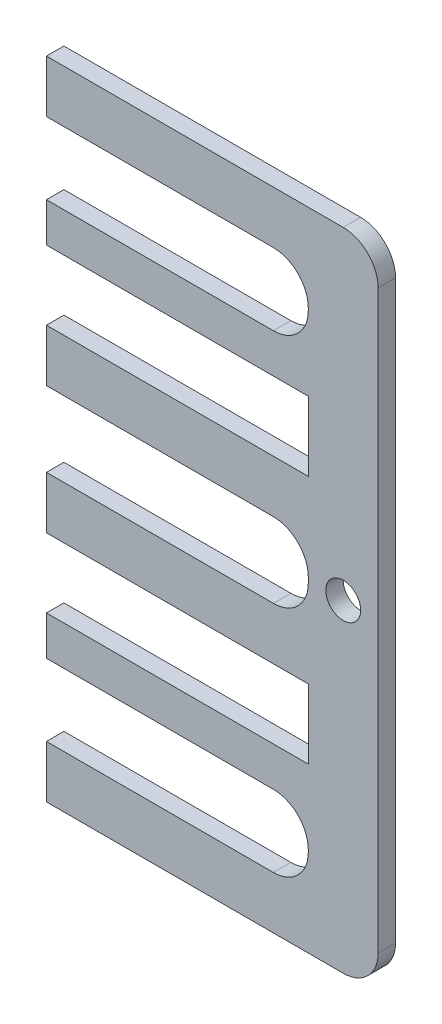
ISO-10303-21;
HEADER;
FILE_DESCRIPTION(('STEP AP214'),'2;1');
FILE_NAME('part.step','',(''),(''),'','','');
FILE_SCHEMA(('AUTOMOTIVE_DESIGN { 1 0 10303 214 1 1 1 1 }'));
ENDSEC;
DATA;
#1=APPLICATION_CONTEXT('core data for automotive mechanical design processes');
#2=APPLICATION_PROTOCOL_DEFINITION('international standard','automotive_design',2000,#1);
#3=PRODUCT_CONTEXT('',#1,'mechanical');
#4=PRODUCT('Part','Part','',(#3));
#5=PRODUCT_RELATED_PRODUCT_CATEGORY('part','',(#4));
#6=PRODUCT_DEFINITION_FORMATION('','',#4);
#7=PRODUCT_DEFINITION_CONTEXT('part definition',#1,'design');
#8=PRODUCT_DEFINITION('design','',#6,#7);
#9=PRODUCT_DEFINITION_SHAPE('','',#8);
#10=(LENGTH_UNIT() NAMED_UNIT(*) SI_UNIT(.MILLI.,.METRE.));
#11=(NAMED_UNIT(*) PLANE_ANGLE_UNIT() SI_UNIT($,.RADIAN.));
#12=(NAMED_UNIT(*) SI_UNIT($,.STERADIAN.) SOLID_ANGLE_UNIT());
#13=UNCERTAINTY_MEASURE_WITH_UNIT(LENGTH_MEASURE(1.E-05),#10,'distance_accuracy_value','');
#14=(GEOMETRIC_REPRESENTATION_CONTEXT(3) GLOBAL_UNCERTAINTY_ASSIGNED_CONTEXT((#13)) GLOBAL_UNIT_ASSIGNED_CONTEXT((#10,
#11,#12)) REPRESENTATION_CONTEXT('',''));
#15=CARTESIAN_POINT('',(0.,0.,0.));
#16=DIRECTION('',(0.,0.,1.));
#17=DIRECTION('',(1.,0.,0.));
#18=AXIS2_PLACEMENT_3D('',#15,#16,#17);
#19=CARTESIAN_POINT('',(0.,0.,2.));
#20=DIRECTION('',(0.,0.,1.));
#21=DIRECTION('',(1.,0.,0.));
#22=AXIS2_PLACEMENT_3D('',#19,#20,#21);
#23=PLANE('',#22);
#24=DIRECTION('',(1.,0.,0.));
#25=VECTOR('',#24,1.);
#26=CARTESIAN_POINT('',(0.,-37.,2.));
#27=LINE('',#26,#25);
#28=CARTESIAN_POINT('',(-38.,-37.,2.));
#29=VERTEX_POINT('',#28);
#30=CARTESIAN_POINT('',(-3.99999999999999,-37.,2.));
#31=VERTEX_POINT('',#30);
#32=EDGE_CURVE('E271',#29,#31,#27,.T.);
#33=ORIENTED_EDGE('',*,*,#32,.T.);
#34=CARTESIAN_POINT('',(-3.99999999999999,-33.,2.));
#35=DIRECTION('',(0.,0.,1.));
#36=DIRECTION('',(1.,0.,0.));
#37=AXIS2_PLACEMENT_3D('',#34,#35,#36);
#38=CIRCLE('',#37,4.);
#39=CARTESIAN_POINT('',(0.,-33.,2.));
#40=VERTEX_POINT('',#39);
#41=EDGE_CURVE('E342',#31,#40,#38,.T.);
#42=ORIENTED_EDGE('',*,*,#41,.T.);
#43=DIRECTION('',(0.,1.,0.));
#44=VECTOR('',#43,1.);
#45=CARTESIAN_POINT('',(0.,37.,2.));
#46=LINE('',#45,#44);
#47=CARTESIAN_POINT('',(0.,33.,2.));
#48=VERTEX_POINT('',#47);
#49=EDGE_CURVE('E986',#40,#48,#46,.T.);
#50=ORIENTED_EDGE('',*,*,#49,.T.);
#51=CARTESIAN_POINT('',(-3.99999999999999,33.,2.));
#52=DIRECTION('',(0.,0.,1.));
#53=DIRECTION('',(1.,0.,0.));
#54=AXIS2_PLACEMENT_3D('',#51,#52,#53);
#55=CIRCLE('',#54,4.);
#56=CARTESIAN_POINT('',(-3.99999999999999,37.,2.));
#57=VERTEX_POINT('',#56);
#58=EDGE_CURVE('E55',#48,#57,#55,.T.);
#59=ORIENTED_EDGE('',*,*,#58,.T.);
#60=DIRECTION('',(-1.,0.,0.));
#61=VECTOR('',#60,1.);
#62=CARTESIAN_POINT('',(0.,37.,2.));
#63=LINE('',#62,#61);
#64=CARTESIAN_POINT('',(-38.,37.,2.));
#65=VERTEX_POINT('',#64);
#66=EDGE_CURVE('E984',#57,#65,#63,.T.);
#67=ORIENTED_EDGE('',*,*,#66,.T.);
#68=DIRECTION('',(0.,-1.,0.));
#69=VECTOR('',#68,1.);
#70=CARTESIAN_POINT('',(-38.,31.,2.));
#71=LINE('',#70,#69);
#72=CARTESIAN_POINT('',(-38.,31.,2.));
#73=VERTEX_POINT('',#72);
#74=EDGE_CURVE('E545',#65,#73,#71,.T.);
#75=ORIENTED_EDGE('',*,*,#74,.T.);
#76=DIRECTION('',(1.,0.,0.));
#77=VECTOR('',#76,1.);
#78=CARTESIAN_POINT('',(-38.,31.,2.));
#79=LINE('',#78,#77);
#80=CARTESIAN_POINT('',(-12.,31.,2.));
#81=VERTEX_POINT('',#80);
#82=EDGE_CURVE('E563',#73,#81,#79,.T.);
#83=ORIENTED_EDGE('',*,*,#82,.T.);
#84=CARTESIAN_POINT('',(-12.,27.,2.));
#85=DIRECTION('',(0.,0.,1.));
#86=DIRECTION('',(1.,0.,0.));
#87=AXIS2_PLACEMENT_3D('',#84,#85,#86);
#88=CIRCLE('',#87,4.);
#89=CARTESIAN_POINT('',(-8.00000000000001,27.,2.));
#90=VERTEX_POINT('',#89);
#91=EDGE_CURVE('E358',#81,#90,#88,.F.);
#92=ORIENTED_EDGE('',*,*,#91,.T.);
#93=DIRECTION('',(0.,-1.,0.));
#94=VECTOR('',#93,1.);
#95=CARTESIAN_POINT('',(-8.00000000000001,31.,2.));
#96=LINE('',#95,#94);
#97=CARTESIAN_POINT('',(-8.00000000000001,26.75,2.));
#98=VERTEX_POINT('',#97);
#99=EDGE_CURVE('E561',#90,#98,#96,.T.);
#100=ORIENTED_EDGE('',*,*,#99,.T.);
#101=CARTESIAN_POINT('',(-12.,26.75,2.));
#102=DIRECTION('',(0.,0.,1.));
#103=DIRECTION('',(1.,0.,0.));
#104=AXIS2_PLACEMENT_3D('',#101,#102,#103);
#105=CIRCLE('',#104,4.);
#106=CARTESIAN_POINT('',(-12.,22.75,2.));
#107=VERTEX_POINT('',#106);
#108=EDGE_CURVE('E352',#98,#107,#105,.F.);
#109=ORIENTED_EDGE('',*,*,#108,.T.);
#110=DIRECTION('',(-1.,0.,0.));
#111=VECTOR('',#110,1.);
#112=CARTESIAN_POINT('',(-8.00000000000001,22.75,2.));
#113=LINE('',#112,#111);
#114=CARTESIAN_POINT('',(-38.,22.75,2.));
#115=VERTEX_POINT('',#114);
#116=EDGE_CURVE('E568',#107,#115,#113,.T.);
#117=ORIENTED_EDGE('',*,*,#116,.T.);
#118=DIRECTION('',(0.,-1.,0.));
#119=VECTOR('',#118,1.);
#120=CARTESIAN_POINT('',(-38.,22.75,2.));
#121=LINE('',#120,#119);
#122=CARTESIAN_POINT('',(-38.,18.25,2.));
#123=VERTEX_POINT('',#122);
#124=EDGE_CURVE('E572',#115,#123,#121,.T.);
#125=ORIENTED_EDGE('',*,*,#124,.T.);
#126=DIRECTION('',(1.,0.,0.));
#127=VECTOR('',#126,1.);
#128=CARTESIAN_POINT('',(-38.,18.25,2.));
#129=LINE('',#128,#127);
#130=CARTESIAN_POINT('',(-8.00000000000001,18.25,2.));
#131=VERTEX_POINT('',#130);
#132=EDGE_CURVE('E579',#123,#131,#129,.T.);
#133=ORIENTED_EDGE('',*,*,#132,.T.);
#134=DIRECTION('',(0.,-1.,0.));
#135=VECTOR('',#134,1.);
#136=CARTESIAN_POINT('',(-8.00000000000001,18.25,2.));
#137=LINE('',#136,#135);
#138=CARTESIAN_POINT('',(-8.00000000000001,10.3,2.));
#139=VERTEX_POINT('',#138);
#140=EDGE_CURVE('E582',#131,#139,#137,.T.);
#141=ORIENTED_EDGE('',*,*,#140,.T.);
#142=DIRECTION('',(-1.,0.,0.));
#143=VECTOR('',#142,1.);
#144=CARTESIAN_POINT('',(-8.00000000000001,10.3,2.));
#145=LINE('',#144,#143);
#146=CARTESIAN_POINT('',(-38.,10.3,2.));
#147=VERTEX_POINT('',#146);
#148=EDGE_CURVE('E585',#139,#147,#145,.T.);
#149=ORIENTED_EDGE('',*,*,#148,.T.);
#150=DIRECTION('',(0.,-1.,0.));
#151=VECTOR('',#150,1.);
#152=CARTESIAN_POINT('',(-38.,10.3,2.));
#153=LINE('',#152,#151);
#154=CARTESIAN_POINT('',(-38.,4.3,2.));
#155=VERTEX_POINT('',#154);
#156=EDGE_CURVE('E588',#147,#155,#153,.T.);
#157=ORIENTED_EDGE('',*,*,#156,.T.);
#158=DIRECTION('',(1.,0.,0.));
#159=VECTOR('',#158,1.);
#160=CARTESIAN_POINT('',(-38.,4.3,2.));
#161=LINE('',#160,#159);
#162=CARTESIAN_POINT('',(-12.,4.3,2.));
#163=VERTEX_POINT('',#162);
#164=EDGE_CURVE('E591',#155,#163,#161,.T.);
#165=ORIENTED_EDGE('',*,*,#164,.T.);
#166=CARTESIAN_POINT('',(-12.,0.3,2.));
#167=DIRECTION('',(0.,0.,1.));
#168=DIRECTION('',(1.,0.,0.));
#169=AXIS2_PLACEMENT_3D('',#166,#167,#168);
#170=CIRCLE('',#169,4.);
#171=CARTESIAN_POINT('',(-8.00000000000001,0.299999999999998,2.));
#172=VERTEX_POINT('',#171);
#173=EDGE_CURVE('E370',#163,#172,#170,.F.);
#174=ORIENTED_EDGE('',*,*,#173,.T.);
#175=DIRECTION('',(0.,-1.,0.));
#176=VECTOR('',#175,1.);
#177=CARTESIAN_POINT('',(-8.00000000000001,-4.3,2.));
#178=LINE('',#177,#176);
#179=CARTESIAN_POINT('',(-8.00000000000001,-0.300000000000002,2.));
#180=VERTEX_POINT('',#179);
#181=EDGE_CURVE('E595',#172,#180,#178,.T.);
#182=ORIENTED_EDGE('',*,*,#181,.T.);
#183=CARTESIAN_POINT('',(-12.,-0.3,2.));
#184=DIRECTION('',(0.,0.,1.));
#185=DIRECTION('',(1.,0.,0.));
#186=AXIS2_PLACEMENT_3D('',#183,#184,#185);
#187=CIRCLE('',#186,4.);
#188=CARTESIAN_POINT('',(-12.,-4.3,2.));
#189=VERTEX_POINT('',#188);
#190=EDGE_CURVE('E364',#180,#189,#187,.F.);
#191=ORIENTED_EDGE('',*,*,#190,.T.);
#192=DIRECTION('',(-1.,0.,0.));
#193=VECTOR('',#192,1.);
#194=CARTESIAN_POINT('',(-38.,-4.3,2.));
#195=LINE('',#194,#193);
#196=CARTESIAN_POINT('',(-38.,-4.3,2.));
#197=VERTEX_POINT('',#196);
#198=EDGE_CURVE('E599',#189,#197,#195,.T.);
#199=ORIENTED_EDGE('',*,*,#198,.T.);
#200=DIRECTION('',(0.,-1.,0.));
#201=VECTOR('',#200,1.);
#202=CARTESIAN_POINT('',(-38.,-10.3,2.));
#203=LINE('',#202,#201);
#204=CARTESIAN_POINT('',(-38.,-10.3,2.));
#205=VERTEX_POINT('',#204);
#206=EDGE_CURVE('E602',#197,#205,#203,.T.);
#207=ORIENTED_EDGE('',*,*,#206,.T.);
#208=DIRECTION('',(1.,0.,0.));
#209=VECTOR('',#208,1.);
#210=CARTESIAN_POINT('',(-8.00000000000001,-10.3,2.));
#211=LINE('',#210,#209);
#212=CARTESIAN_POINT('',(-8.00000000000001,-10.3,2.));
#213=VERTEX_POINT('',#212);
#214=EDGE_CURVE('E605',#205,#213,#211,.T.);
#215=ORIENTED_EDGE('',*,*,#214,.T.);
#216=DIRECTION('',(0.,-1.,0.));
#217=VECTOR('',#216,1.);
#218=CARTESIAN_POINT('',(-8.00000000000001,-18.25,2.));
#219=LINE('',#218,#217);
#220=CARTESIAN_POINT('',(-8.00000000000001,-18.25,2.));
#221=VERTEX_POINT('',#220);
#222=EDGE_CURVE('E608',#213,#221,#219,.T.);
#223=ORIENTED_EDGE('',*,*,#222,.T.);
#224=DIRECTION('',(-1.,0.,0.));
#225=VECTOR('',#224,1.);
#226=CARTESIAN_POINT('',(-38.,-18.25,2.));
#227=LINE('',#226,#225);
#228=CARTESIAN_POINT('',(-38.,-18.25,2.));
#229=VERTEX_POINT('',#228);
#230=EDGE_CURVE('E611',#221,#229,#227,.T.);
#231=ORIENTED_EDGE('',*,*,#230,.T.);
#232=DIRECTION('',(0.,-1.,0.));
#233=VECTOR('',#232,1.);
#234=CARTESIAN_POINT('',(-38.,-22.75,2.));
#235=LINE('',#234,#233);
#236=CARTESIAN_POINT('',(-38.,-22.75,2.));
#237=VERTEX_POINT('',#236);
#238=EDGE_CURVE('E415',#229,#237,#235,.T.);
#239=ORIENTED_EDGE('',*,*,#238,.T.);
#240=DIRECTION('',(1.,0.,0.));
#241=VECTOR('',#240,1.);
#242=CARTESIAN_POINT('',(-8.00000000000001,-22.75,2.));
#243=LINE('',#242,#241);
#244=CARTESIAN_POINT('',(-12.,-22.75,2.));
#245=VERTEX_POINT('',#244);
#246=EDGE_CURVE('E405',#237,#245,#243,.T.);
#247=ORIENTED_EDGE('',*,*,#246,.T.);
#248=CARTESIAN_POINT('',(-12.,-26.75,2.));
#249=DIRECTION('',(0.,0.,1.));
#250=DIRECTION('',(1.,0.,0.));
#251=AXIS2_PLACEMENT_3D('',#248,#249,#250);
#252=CIRCLE('',#251,4.);
#253=CARTESIAN_POINT('',(-8.00000000000001,-26.75,2.));
#254=VERTEX_POINT('',#253);
#255=EDGE_CURVE('E11',#245,#254,#252,.F.);
#256=ORIENTED_EDGE('',*,*,#255,.T.);
#257=DIRECTION('',(0.,-1.,0.));
#258=VECTOR('',#257,1.);
#259=CARTESIAN_POINT('',(-8.00000000000001,-31.,2.));
#260=LINE('',#259,#258);
#261=CARTESIAN_POINT('',(-8.00000000000001,-27.,2.));
#262=VERTEX_POINT('',#261);
#263=EDGE_CURVE('E404',#254,#262,#260,.T.);
#264=ORIENTED_EDGE('',*,*,#263,.T.);
#265=CARTESIAN_POINT('',(-12.,-27.,2.));
#266=DIRECTION('',(0.,0.,1.));
#267=DIRECTION('',(1.,0.,0.));
#268=AXIS2_PLACEMENT_3D('',#265,#266,#267);
#269=CIRCLE('',#268,4.);
#270=CARTESIAN_POINT('',(-12.,-31.,2.));
#271=VERTEX_POINT('',#270);
#272=EDGE_CURVE('E256',#262,#271,#269,.F.);
#273=ORIENTED_EDGE('',*,*,#272,.T.);
#274=DIRECTION('',(-1.,0.,0.));
#275=VECTOR('',#274,1.);
#276=CARTESIAN_POINT('',(-38.,-31.,2.));
#277=LINE('',#276,#275);
#278=CARTESIAN_POINT('',(-38.,-31.,2.));
#279=VERTEX_POINT('',#278);
#280=EDGE_CURVE('E249',#271,#279,#277,.T.);
#281=ORIENTED_EDGE('',*,*,#280,.T.);
#282=DIRECTION('',(0.,-1.,0.));
#283=VECTOR('',#282,1.);
#284=CARTESIAN_POINT('',(-38.,-31.,2.));
#285=LINE('',#284,#283);
#286=EDGE_CURVE('E252',#279,#29,#285,.T.);
#287=ORIENTED_EDGE('',*,*,#286,.T.);
#288=EDGE_LOOP('',(#33,#42,#50,#59,#67,#75,#83,#92,#100,#109,#117,#125,#133,#141,#149,#157,#165,
#174,#182,#191,#199,#207,#215,#223,#231,#239,#247,#256,#264,#273,#281,#287));
#289=FACE_BOUND('',#288,.T.);
#290=CARTESIAN_POINT('',(-4.,0.,2.));
#291=DIRECTION('',(0.,0.,1.));
#292=DIRECTION('',(1.,0.,0.));
#293=AXIS2_PLACEMENT_3D('',#290,#291,#292);
#294=CIRCLE('',#293,2.);
#295=CARTESIAN_POINT('',(-2.,0.,2.));
#296=VERTEX_POINT('',#295);
#297=EDGE_CURVE('E422',#296,#296,#294,.T.);
#298=ORIENTED_EDGE('',*,*,#297,.F.);
#299=EDGE_LOOP('',(#298));
#300=FACE_BOUND('',#299,.T.);
#301=ADVANCED_FACE('F39',(#289,#300),#23,.T.);
#302=CARTESIAN_POINT('',(0.,0.,0.));
#303=DIRECTION('',(0.,0.,1.));
#304=DIRECTION('',(1.,0.,0.));
#305=AXIS2_PLACEMENT_3D('',#302,#303,#304);
#306=PLANE('',#305);
#307=DIRECTION('',(0.,1.,0.));
#308=VECTOR('',#307,1.);
#309=CARTESIAN_POINT('',(0.,37.,0.));
#310=LINE('',#309,#308);
#311=CARTESIAN_POINT('',(0.,-33.,0.));
#312=VERTEX_POINT('',#311);
#313=CARTESIAN_POINT('',(0.,33.,0.));
#314=VERTEX_POINT('',#313);
#315=EDGE_CURVE('E428',#312,#314,#310,.T.);
#316=ORIENTED_EDGE('',*,*,#315,.F.);
#317=CARTESIAN_POINT('',(-3.99999999999999,-33.,0.));
#318=DIRECTION('',(0.,0.,1.));
#319=DIRECTION('',(1.,0.,0.));
#320=AXIS2_PLACEMENT_3D('',#317,#318,#319);
#321=CIRCLE('',#320,4.);
#322=CARTESIAN_POINT('',(-3.99999999999999,-37.,0.));
#323=VERTEX_POINT('',#322);
#324=EDGE_CURVE('E335',#312,#323,#321,.F.);
#325=ORIENTED_EDGE('',*,*,#324,.T.);
#326=DIRECTION('',(1.,0.,0.));
#327=VECTOR('',#326,1.);
#328=CARTESIAN_POINT('',(0.,-37.,0.));
#329=LINE('',#328,#327);
#330=CARTESIAN_POINT('',(-38.,-37.,0.));
#331=VERTEX_POINT('',#330);
#332=EDGE_CURVE('E425',#331,#323,#329,.T.);
#333=ORIENTED_EDGE('',*,*,#332,.F.);
#334=DIRECTION('',(0.,-1.,0.));
#335=VECTOR('',#334,1.);
#336=CARTESIAN_POINT('',(-38.,-31.,0.));
#337=LINE('',#336,#335);
#338=CARTESIAN_POINT('',(-38.,-31.,0.));
#339=VERTEX_POINT('',#338);
#340=EDGE_CURVE('E421',#339,#331,#337,.T.);
#341=ORIENTED_EDGE('',*,*,#340,.F.);
#342=DIRECTION('',(-1.,0.,0.));
#343=VECTOR('',#342,1.);
#344=CARTESIAN_POINT('',(-38.,-31.,0.));
#345=LINE('',#344,#343);
#346=CARTESIAN_POINT('',(-12.,-31.,0.));
#347=VERTEX_POINT('',#346);
#348=EDGE_CURVE('E275',#347,#339,#345,.T.);
#349=ORIENTED_EDGE('',*,*,#348,.F.);
#350=CARTESIAN_POINT('',(-12.,-27.,0.));
#351=DIRECTION('',(0.,0.,1.));
#352=DIRECTION('',(1.,0.,0.));
#353=AXIS2_PLACEMENT_3D('',#350,#351,#352);
#354=CIRCLE('',#353,4.);
#355=CARTESIAN_POINT('',(-8.00000000000001,-27.,0.));
#356=VERTEX_POINT('',#355);
#357=EDGE_CURVE('E373',#347,#356,#354,.T.);
#358=ORIENTED_EDGE('',*,*,#357,.T.);
#359=DIRECTION('',(0.,-1.,0.));
#360=VECTOR('',#359,1.);
#361=CARTESIAN_POINT('',(-8.00000000000001,-31.,0.));
#362=LINE('',#361,#360);
#363=CARTESIAN_POINT('',(-8.00000000000001,-26.75,0.));
#364=VERTEX_POINT('',#363);
#365=EDGE_CURVE('E262',#364,#356,#362,.T.);
#366=ORIENTED_EDGE('',*,*,#365,.F.);
#367=CARTESIAN_POINT('',(-12.,-26.75,0.));
#368=DIRECTION('',(0.,0.,1.));
#369=DIRECTION('',(1.,0.,0.));
#370=AXIS2_PLACEMENT_3D('',#367,#368,#369);
#371=CIRCLE('',#370,4.);
#372=CARTESIAN_POINT('',(-12.,-22.75,0.));
#373=VERTEX_POINT('',#372);
#374=EDGE_CURVE('E48',#364,#373,#371,.T.);
#375=ORIENTED_EDGE('',*,*,#374,.T.);
#376=DIRECTION('',(1.,0.,0.));
#377=VECTOR('',#376,1.);
#378=CARTESIAN_POINT('',(-8.00000000000001,-22.75,0.));
#379=LINE('',#378,#377);
#380=CARTESIAN_POINT('',(-38.,-22.75,0.));
#381=VERTEX_POINT('',#380);
#382=EDGE_CURVE('E386',#381,#373,#379,.T.);
#383=ORIENTED_EDGE('',*,*,#382,.F.);
#384=DIRECTION('',(0.,-1.,0.));
#385=VECTOR('',#384,1.);
#386=CARTESIAN_POINT('',(-38.,-22.75,0.));
#387=LINE('',#386,#385);
#388=CARTESIAN_POINT('',(-38.,-18.25,0.));
#389=VERTEX_POINT('',#388);
#390=EDGE_CURVE('E399',#389,#381,#387,.T.);
#391=ORIENTED_EDGE('',*,*,#390,.F.);
#392=DIRECTION('',(-1.,0.,0.));
#393=VECTOR('',#392,1.);
#394=CARTESIAN_POINT('',(-38.,-18.25,0.));
#395=LINE('',#394,#393);
#396=CARTESIAN_POINT('',(-8.00000000000001,-18.25,0.));
#397=VERTEX_POINT('',#396);
#398=EDGE_CURVE('E484',#397,#389,#395,.T.);
#399=ORIENTED_EDGE('',*,*,#398,.F.);
#400=DIRECTION('',(0.,-1.,0.));
#401=VECTOR('',#400,1.);
#402=CARTESIAN_POINT('',(-8.00000000000001,-18.25,0.));
#403=LINE('',#402,#401);
#404=CARTESIAN_POINT('',(-8.00000000000001,-10.3,0.));
#405=VERTEX_POINT('',#404);
#406=EDGE_CURVE('E481',#405,#397,#403,.T.);
#407=ORIENTED_EDGE('',*,*,#406,.F.);
#408=DIRECTION('',(1.,0.,0.));
#409=VECTOR('',#408,1.);
#410=CARTESIAN_POINT('',(-8.00000000000001,-10.3,0.));
#411=LINE('',#410,#409);
#412=CARTESIAN_POINT('',(-38.,-10.3,0.));
#413=VERTEX_POINT('',#412);
#414=EDGE_CURVE('E478',#413,#405,#411,.T.);
#415=ORIENTED_EDGE('',*,*,#414,.F.);
#416=DIRECTION('',(0.,-1.,0.));
#417=VECTOR('',#416,1.);
#418=CARTESIAN_POINT('',(-38.,-10.3,0.));
#419=LINE('',#418,#417);
#420=CARTESIAN_POINT('',(-38.,-4.3,0.));
#421=VERTEX_POINT('',#420);
#422=EDGE_CURVE('E475',#421,#413,#419,.T.);
#423=ORIENTED_EDGE('',*,*,#422,.F.);
#424=DIRECTION('',(-1.,0.,0.));
#425=VECTOR('',#424,1.);
#426=CARTESIAN_POINT('',(-38.,-4.3,0.));
#427=LINE('',#426,#425);
#428=CARTESIAN_POINT('',(-12.,-4.3,0.));
#429=VERTEX_POINT('',#428);
#430=EDGE_CURVE('E472',#429,#421,#427,.T.);
#431=ORIENTED_EDGE('',*,*,#430,.F.);
#432=CARTESIAN_POINT('',(-12.,-0.3,0.));
#433=DIRECTION('',(0.,0.,1.));
#434=DIRECTION('',(1.,0.,0.));
#435=AXIS2_PLACEMENT_3D('',#432,#433,#434);
#436=CIRCLE('',#435,4.);
#437=CARTESIAN_POINT('',(-8.00000000000001,-0.300000000000002,0.));
#438=VERTEX_POINT('',#437);
#439=EDGE_CURVE('E361',#429,#438,#436,.T.);
#440=ORIENTED_EDGE('',*,*,#439,.T.);
#441=DIRECTION('',(0.,-1.,0.));
#442=VECTOR('',#441,1.);
#443=CARTESIAN_POINT('',(-8.00000000000001,-4.3,0.));
#444=LINE('',#443,#442);
#445=CARTESIAN_POINT('',(-8.00000000000001,0.299999999999998,0.));
#446=VERTEX_POINT('',#445);
#447=EDGE_CURVE('E468',#446,#438,#444,.T.);
#448=ORIENTED_EDGE('',*,*,#447,.F.);
#449=CARTESIAN_POINT('',(-12.,0.3,0.));
#450=DIRECTION('',(0.,0.,1.));
#451=DIRECTION('',(1.,0.,0.));
#452=AXIS2_PLACEMENT_3D('',#449,#450,#451);
#453=CIRCLE('',#452,4.);
#454=CARTESIAN_POINT('',(-12.,4.3,0.));
#455=VERTEX_POINT('',#454);
#456=EDGE_CURVE('E367',#446,#455,#453,.T.);
#457=ORIENTED_EDGE('',*,*,#456,.T.);
#458=DIRECTION('',(1.,0.,0.));
#459=VECTOR('',#458,1.);
#460=CARTESIAN_POINT('',(-38.,4.3,0.));
#461=LINE('',#460,#459);
#462=CARTESIAN_POINT('',(-38.,4.3,0.));
#463=VERTEX_POINT('',#462);
#464=EDGE_CURVE('E464',#463,#455,#461,.T.);
#465=ORIENTED_EDGE('',*,*,#464,.F.);
#466=DIRECTION('',(0.,-1.,0.));
#467=VECTOR('',#466,1.);
#468=CARTESIAN_POINT('',(-38.,10.3,0.));
#469=LINE('',#468,#467);
#470=CARTESIAN_POINT('',(-38.,10.3,0.));
#471=VERTEX_POINT('',#470);
#472=EDGE_CURVE('E461',#471,#463,#469,.T.);
#473=ORIENTED_EDGE('',*,*,#472,.F.);
#474=DIRECTION('',(-1.,0.,0.));
#475=VECTOR('',#474,1.);
#476=CARTESIAN_POINT('',(-8.00000000000001,10.3,0.));
#477=LINE('',#476,#475);
#478=CARTESIAN_POINT('',(-8.00000000000001,10.3,0.));
#479=VERTEX_POINT('',#478);
#480=EDGE_CURVE('E458',#479,#471,#477,.T.);
#481=ORIENTED_EDGE('',*,*,#480,.F.);
#482=DIRECTION('',(0.,-1.,0.));
#483=VECTOR('',#482,1.);
#484=CARTESIAN_POINT('',(-8.00000000000001,18.25,0.));
#485=LINE('',#484,#483);
#486=CARTESIAN_POINT('',(-8.00000000000001,18.25,0.));
#487=VERTEX_POINT('',#486);
#488=EDGE_CURVE('E455',#487,#479,#485,.T.);
#489=ORIENTED_EDGE('',*,*,#488,.F.);
#490=DIRECTION('',(1.,0.,0.));
#491=VECTOR('',#490,1.);
#492=CARTESIAN_POINT('',(-38.,18.25,0.));
#493=LINE('',#492,#491);
#494=CARTESIAN_POINT('',(-38.,18.25,0.));
#495=VERTEX_POINT('',#494);
#496=EDGE_CURVE('E452',#495,#487,#493,.T.);
#497=ORIENTED_EDGE('',*,*,#496,.F.);
#498=DIRECTION('',(0.,-1.,0.));
#499=VECTOR('',#498,1.);
#500=CARTESIAN_POINT('',(-38.,22.75,0.));
#501=LINE('',#500,#499);
#502=CARTESIAN_POINT('',(-38.,22.75,0.));
#503=VERTEX_POINT('',#502);
#504=EDGE_CURVE('E449',#503,#495,#501,.T.);
#505=ORIENTED_EDGE('',*,*,#504,.F.);
#506=DIRECTION('',(-1.,0.,0.));
#507=VECTOR('',#506,1.);
#508=CARTESIAN_POINT('',(-8.00000000000001,22.75,0.));
#509=LINE('',#508,#507);
#510=CARTESIAN_POINT('',(-12.,22.75,0.));
#511=VERTEX_POINT('',#510);
#512=EDGE_CURVE('E446',#511,#503,#509,.T.);
#513=ORIENTED_EDGE('',*,*,#512,.F.);
#514=CARTESIAN_POINT('',(-12.,26.75,0.));
#515=DIRECTION('',(0.,0.,1.));
#516=DIRECTION('',(1.,0.,0.));
#517=AXIS2_PLACEMENT_3D('',#514,#515,#516);
#518=CIRCLE('',#517,4.);
#519=CARTESIAN_POINT('',(-8.00000000000001,26.75,0.));
#520=VERTEX_POINT('',#519);
#521=EDGE_CURVE('E349',#511,#520,#518,.T.);
#522=ORIENTED_EDGE('',*,*,#521,.T.);
#523=DIRECTION('',(0.,-1.,0.));
#524=VECTOR('',#523,1.);
#525=CARTESIAN_POINT('',(-8.00000000000001,31.,0.));
#526=LINE('',#525,#524);
#527=CARTESIAN_POINT('',(-8.00000000000001,27.,0.));
#528=VERTEX_POINT('',#527);
#529=EDGE_CURVE('E442',#528,#520,#526,.T.);
#530=ORIENTED_EDGE('',*,*,#529,.F.);
#531=CARTESIAN_POINT('',(-12.,27.,0.));
#532=DIRECTION('',(0.,0.,1.));
#533=DIRECTION('',(1.,0.,0.));
#534=AXIS2_PLACEMENT_3D('',#531,#532,#533);
#535=CIRCLE('',#534,4.);
#536=CARTESIAN_POINT('',(-12.,31.,0.));
#537=VERTEX_POINT('',#536);
#538=EDGE_CURVE('E355',#528,#537,#535,.T.);
#539=ORIENTED_EDGE('',*,*,#538,.T.);
#540=DIRECTION('',(1.,0.,0.));
#541=VECTOR('',#540,1.);
#542=CARTESIAN_POINT('',(-38.,31.,0.));
#543=LINE('',#542,#541);
#544=CARTESIAN_POINT('',(-38.,31.,0.));
#545=VERTEX_POINT('',#544);
#546=EDGE_CURVE('E438',#545,#537,#543,.T.);
#547=ORIENTED_EDGE('',*,*,#546,.F.);
#548=DIRECTION('',(0.,-1.,0.));
#549=VECTOR('',#548,1.);
#550=CARTESIAN_POINT('',(-38.,31.,0.));
#551=LINE('',#550,#549);
#552=CARTESIAN_POINT('',(-38.,37.,0.));
#553=VERTEX_POINT('',#552);
#554=EDGE_CURVE('E435',#553,#545,#551,.T.);
#555=ORIENTED_EDGE('',*,*,#554,.F.);
#556=DIRECTION('',(-1.,0.,0.));
#557=VECTOR('',#556,1.);
#558=CARTESIAN_POINT('',(0.,37.,0.));
#559=LINE('',#558,#557);
#560=CARTESIAN_POINT('',(-3.99999999999999,37.,0.));
#561=VERTEX_POINT('',#560);
#562=EDGE_CURVE('E432',#561,#553,#559,.T.);
#563=ORIENTED_EDGE('',*,*,#562,.F.);
#564=CARTESIAN_POINT('',(-3.99999999999999,33.,0.));
#565=DIRECTION('',(0.,0.,1.));
#566=DIRECTION('',(1.,0.,0.));
#567=AXIS2_PLACEMENT_3D('',#564,#565,#566);
#568=CIRCLE('',#567,4.);
#569=EDGE_CURVE('E332',#561,#314,#568,.F.);
#570=ORIENTED_EDGE('',*,*,#569,.T.);
#571=EDGE_LOOP('',(#316,#325,#333,#341,#349,#358,#366,#375,#383,#391,#399,#407,#415,#423,#431,
#440,#448,#457,#465,#473,#481,#489,#497,#505,#513,#522,#530,#539,#547,#555,#563,#570));
#572=FACE_BOUND('',#571,.T.);
#573=CARTESIAN_POINT('',(-4.,0.,0.));
#574=DIRECTION('',(0.,0.,1.));
#575=DIRECTION('',(1.,0.,0.));
#576=AXIS2_PLACEMENT_3D('',#573,#574,#575);
#577=CIRCLE('',#576,2.);
#578=CARTESIAN_POINT('',(-2.,0.,0.));
#579=VERTEX_POINT('',#578);
#580=EDGE_CURVE('E994',#579,#579,#577,.T.);
#581=ORIENTED_EDGE('',*,*,#580,.T.);
#582=EDGE_LOOP('',(#581));
#583=FACE_BOUND('',#582,.T.);
#584=ADVANCED_FACE('F383',(#572,#583),#306,.F.);
#585=CARTESIAN_POINT('',(-38.,-31.,2.));
#586=DIRECTION('',(0.,-1.,0.));
#587=DIRECTION('',(1.,0.,0.));
#588=AXIS2_PLACEMENT_3D('',#585,#586,#587);
#589=PLANE('',#588);
#590=ORIENTED_EDGE('',*,*,#280,.F.);
#591=DIRECTION('',(0.,0.,-1.));
#592=VECTOR('',#591,1.);
#593=CARTESIAN_POINT('',(-12.,-31.,0.));
#594=LINE('',#593,#592);
#595=EDGE_CURVE('E312',#271,#347,#594,.T.);
#596=ORIENTED_EDGE('',*,*,#595,.T.);
#597=ORIENTED_EDGE('',*,*,#348,.T.);
#598=DIRECTION('',(0.,0.,-1.));
#599=VECTOR('',#598,1.);
#600=CARTESIAN_POINT('',(-38.,-31.,2.));
#601=LINE('',#600,#599);
#602=EDGE_CURVE('E267',#279,#339,#601,.T.);
#603=ORIENTED_EDGE('',*,*,#602,.F.);
#604=EDGE_LOOP('',(#590,#596,#597,#603));
#605=FACE_BOUND('',#604,.T.);
#606=ADVANCED_FACE('F273',(#605),#589,.F.);
#607=CARTESIAN_POINT('',(-38.,-31.,2.));
#608=DIRECTION('',(1.,0.,0.));
#609=DIRECTION('',(0.,0.,-1.));
#610=AXIS2_PLACEMENT_3D('',#607,#608,#609);
#611=PLANE('',#610);
#612=ORIENTED_EDGE('',*,*,#340,.T.);
#613=DIRECTION('',(0.,0.,-1.));
#614=VECTOR('',#613,1.);
#615=CARTESIAN_POINT('',(-38.,-37.,2.));
#616=LINE('',#615,#614);
#617=EDGE_CURVE('E269',#29,#331,#616,.T.);
#618=ORIENTED_EDGE('',*,*,#617,.F.);
#619=ORIENTED_EDGE('',*,*,#286,.F.);
#620=ORIENTED_EDGE('',*,*,#602,.T.);
#621=EDGE_LOOP('',(#612,#618,#619,#620));
#622=FACE_BOUND('',#621,.T.);
#623=ADVANCED_FACE('F266',(#622),#611,.F.);
#624=CARTESIAN_POINT('',(0.,-37.,2.));
#625=DIRECTION('',(0.,1.,0.));
#626=DIRECTION('',(-1.,0.,0.));
#627=AXIS2_PLACEMENT_3D('',#624,#625,#626);
#628=PLANE('',#627);
#629=ORIENTED_EDGE('',*,*,#332,.T.);
#630=DIRECTION('',(0.,0.,-1.));
#631=VECTOR('',#630,1.);
#632=CARTESIAN_POINT('',(-3.99999999999999,-37.,2.));
#633=LINE('',#632,#631);
#634=EDGE_CURVE('E63',#323,#31,#633,.F.);
#635=ORIENTED_EDGE('',*,*,#634,.T.);
#636=ORIENTED_EDGE('',*,*,#32,.F.);
#637=ORIENTED_EDGE('',*,*,#617,.T.);
#638=EDGE_LOOP('',(#629,#635,#636,#637));
#639=FACE_BOUND('',#638,.T.);
#640=ADVANCED_FACE('F755',(#639),#628,.F.);
#641=CARTESIAN_POINT('',(0.,37.,2.));
#642=DIRECTION('',(-1.,0.,0.));
#643=DIRECTION('',(0.,0.,1.));
#644=AXIS2_PLACEMENT_3D('',#641,#642,#643);
#645=PLANE('',#644);
#646=ORIENTED_EDGE('',*,*,#49,.F.);
#647=DIRECTION('',(0.,0.,-1.));
#648=VECTOR('',#647,1.);
#649=CARTESIAN_POINT('',(0.,-33.,2.));
#650=LINE('',#649,#648);
#651=EDGE_CURVE('E328',#40,#312,#650,.T.);
#652=ORIENTED_EDGE('',*,*,#651,.T.);
#653=ORIENTED_EDGE('',*,*,#315,.T.);
#654=DIRECTION('',(0.,0.,-1.));
#655=VECTOR('',#654,1.);
#656=CARTESIAN_POINT('',(0.,33.,2.));
#657=LINE('',#656,#655);
#658=EDGE_CURVE('E325',#314,#48,#657,.F.);
#659=ORIENTED_EDGE('',*,*,#658,.T.);
#660=EDGE_LOOP('',(#646,#652,#653,#659));
#661=FACE_BOUND('',#660,.T.);
#662=ADVANCED_FACE('F752',(#661),#645,.F.);
#663=CARTESIAN_POINT('',(0.,37.,2.));
#664=DIRECTION('',(0.,-1.,0.));
#665=DIRECTION('',(1.,0.,0.));
#666=AXIS2_PLACEMENT_3D('',#663,#664,#665);
#667=PLANE('',#666);
#668=ORIENTED_EDGE('',*,*,#66,.F.);
#669=DIRECTION('',(0.,0.,-1.));
#670=VECTOR('',#669,1.);
#671=CARTESIAN_POINT('',(-3.99999999999999,37.,2.));
#672=LINE('',#671,#670);
#673=EDGE_CURVE('E345',#57,#561,#672,.T.);
#674=ORIENTED_EDGE('',*,*,#673,.T.);
#675=ORIENTED_EDGE('',*,*,#562,.T.);
#676=DIRECTION('',(0.,0.,-1.));
#677=VECTOR('',#676,1.);
#678=CARTESIAN_POINT('',(-38.,37.,2.));
#679=LINE('',#678,#677);
#680=EDGE_CURVE('E285',#65,#553,#679,.T.);
#681=ORIENTED_EDGE('',*,*,#680,.F.);
#682=EDGE_LOOP('',(#668,#674,#675,#681));
#683=FACE_BOUND('',#682,.T.);
#684=ADVANCED_FACE('F749',(#683),#667,.F.);
#685=CARTESIAN_POINT('',(-38.,31.,2.));
#686=DIRECTION('',(1.,0.,0.));
#687=DIRECTION('',(0.,0.,-1.));
#688=AXIS2_PLACEMENT_3D('',#685,#686,#687);
#689=PLANE('',#688);
#690=ORIENTED_EDGE('',*,*,#554,.T.);
#691=DIRECTION('',(0.,0.,-1.));
#692=VECTOR('',#691,1.);
#693=CARTESIAN_POINT('',(-38.,31.,2.));
#694=LINE('',#693,#692);
#695=EDGE_CURVE('E534',#73,#545,#694,.T.);
#696=ORIENTED_EDGE('',*,*,#695,.F.);
#697=ORIENTED_EDGE('',*,*,#74,.F.);
#698=ORIENTED_EDGE('',*,*,#680,.T.);
#699=EDGE_LOOP('',(#690,#696,#697,#698));
#700=FACE_BOUND('',#699,.T.);
#701=ADVANCED_FACE('F543',(#700),#689,.F.);
#702=CARTESIAN_POINT('',(-38.,31.,2.));
#703=DIRECTION('',(0.,1.,0.));
#704=DIRECTION('',(-1.,0.,0.));
#705=AXIS2_PLACEMENT_3D('',#702,#703,#704);
#706=PLANE('',#705);
#707=ORIENTED_EDGE('',*,*,#546,.T.);
#708=DIRECTION('',(0.,0.,-1.));
#709=VECTOR('',#708,1.);
#710=CARTESIAN_POINT('',(-12.,31.,2.));
#711=LINE('',#710,#709);
#712=EDGE_CURVE('E295',#537,#81,#711,.F.);
#713=ORIENTED_EDGE('',*,*,#712,.T.);
#714=ORIENTED_EDGE('',*,*,#82,.F.);
#715=ORIENTED_EDGE('',*,*,#695,.T.);
#716=EDGE_LOOP('',(#707,#713,#714,#715));
#717=FACE_BOUND('',#716,.T.);
#718=ADVANCED_FACE('F552',(#717),#706,.F.);
#719=CARTESIAN_POINT('',(-8.00000000000001,31.,2.));
#720=DIRECTION('',(1.,0.,0.));
#721=DIRECTION('',(0.,0.,-1.));
#722=AXIS2_PLACEMENT_3D('',#719,#720,#721);
#723=PLANE('',#722);
#724=ORIENTED_EDGE('',*,*,#529,.T.);
#725=DIRECTION('',(0.,0.,-1.));
#726=VECTOR('',#725,1.);
#727=CARTESIAN_POINT('',(-8.00000000000001,26.75,2.));
#728=LINE('',#727,#726);
#729=EDGE_CURVE('E292',#520,#98,#728,.F.);
#730=ORIENTED_EDGE('',*,*,#729,.T.);
#731=ORIENTED_EDGE('',*,*,#99,.F.);
#732=DIRECTION('',(0.,0.,-1.));
#733=VECTOR('',#732,1.);
#734=CARTESIAN_POINT('',(-8.00000000000001,27.,0.));
#735=LINE('',#734,#733);
#736=EDGE_CURVE('E283',#90,#528,#735,.T.);
#737=ORIENTED_EDGE('',*,*,#736,.T.);
#738=EDGE_LOOP('',(#724,#730,#731,#737));
#739=FACE_BOUND('',#738,.T.);
#740=ADVANCED_FACE('F565',(#739),#723,.F.);
#741=CARTESIAN_POINT('',(-8.00000000000001,22.75,2.));
#742=DIRECTION('',(0.,-1.,0.));
#743=DIRECTION('',(1.,0.,0.));
#744=AXIS2_PLACEMENT_3D('',#741,#742,#743);
#745=PLANE('',#744);
#746=ORIENTED_EDGE('',*,*,#116,.F.);
#747=DIRECTION('',(0.,0.,-1.));
#748=VECTOR('',#747,1.);
#749=CARTESIAN_POINT('',(-12.,22.75,0.));
#750=LINE('',#749,#748);
#751=EDGE_CURVE('E278',#107,#511,#750,.T.);
#752=ORIENTED_EDGE('',*,*,#751,.T.);
#753=ORIENTED_EDGE('',*,*,#512,.T.);
#754=DIRECTION('',(0.,0.,-1.));
#755=VECTOR('',#754,1.);
#756=CARTESIAN_POINT('',(-38.,22.75,2.));
#757=LINE('',#756,#755);
#758=EDGE_CURVE('E530',#115,#503,#757,.T.);
#759=ORIENTED_EDGE('',*,*,#758,.F.);
#760=EDGE_LOOP('',(#746,#752,#753,#759));
#761=FACE_BOUND('',#760,.T.);
#762=ADVANCED_FACE('F689',(#761),#745,.F.);
#763=CARTESIAN_POINT('',(-38.,22.75,2.));
#764=DIRECTION('',(1.,0.,0.));
#765=DIRECTION('',(0.,1.,0.));
#766=AXIS2_PLACEMENT_3D('',#763,#764,#765);
#767=PLANE('',#766);
#768=ORIENTED_EDGE('',*,*,#504,.T.);
#769=DIRECTION('',(0.,0.,-1.));
#770=VECTOR('',#769,1.);
#771=CARTESIAN_POINT('',(-38.,18.25,2.));
#772=LINE('',#771,#770);
#773=EDGE_CURVE('E526',#123,#495,#772,.T.);
#774=ORIENTED_EDGE('',*,*,#773,.F.);
#775=ORIENTED_EDGE('',*,*,#124,.F.);
#776=ORIENTED_EDGE('',*,*,#758,.T.);
#777=EDGE_LOOP('',(#768,#774,#775,#776));
#778=FACE_BOUND('',#777,.T.);
#779=ADVANCED_FACE('F684',(#778),#767,.F.);
#780=CARTESIAN_POINT('',(-38.,18.25,2.));
#781=DIRECTION('',(0.,1.,0.));
#782=DIRECTION('',(-1.,0.,0.));
#783=AXIS2_PLACEMENT_3D('',#780,#781,#782);
#784=PLANE('',#783);
#785=ORIENTED_EDGE('',*,*,#496,.T.);
#786=DIRECTION('',(0.,0.,-1.));
#787=VECTOR('',#786,1.);
#788=CARTESIAN_POINT('',(-8.00000000000001,18.25,2.));
#789=LINE('',#788,#787);
#790=EDGE_CURVE('E522',#131,#487,#789,.T.);
#791=ORIENTED_EDGE('',*,*,#790,.F.);
#792=ORIENTED_EDGE('',*,*,#132,.F.);
#793=ORIENTED_EDGE('',*,*,#773,.T.);
#794=EDGE_LOOP('',(#785,#791,#792,#793));
#795=FACE_BOUND('',#794,.T.);
#796=ADVANCED_FACE('F679',(#795),#784,.F.);
#797=CARTESIAN_POINT('',(-8.00000000000001,18.25,2.));
#798=DIRECTION('',(1.,0.,0.));
#799=DIRECTION('',(0.,0.,-1.));
#800=AXIS2_PLACEMENT_3D('',#797,#798,#799);
#801=PLANE('',#800);
#802=ORIENTED_EDGE('',*,*,#488,.T.);
#803=DIRECTION('',(0.,0.,-1.));
#804=VECTOR('',#803,1.);
#805=CARTESIAN_POINT('',(-8.00000000000001,10.3,2.));
#806=LINE('',#805,#804);
#807=EDGE_CURVE('E518',#139,#479,#806,.T.);
#808=ORIENTED_EDGE('',*,*,#807,.F.);
#809=ORIENTED_EDGE('',*,*,#140,.F.);
#810=ORIENTED_EDGE('',*,*,#790,.T.);
#811=EDGE_LOOP('',(#802,#808,#809,#810));
#812=FACE_BOUND('',#811,.T.);
#813=ADVANCED_FACE('F675',(#812),#801,.F.);
#814=CARTESIAN_POINT('',(-8.00000000000001,10.3,2.));
#815=DIRECTION('',(0.,-1.,0.));
#816=DIRECTION('',(1.,0.,0.));
#817=AXIS2_PLACEMENT_3D('',#814,#815,#816);
#818=PLANE('',#817);
#819=ORIENTED_EDGE('',*,*,#480,.T.);
#820=DIRECTION('',(0.,0.,-1.));
#821=VECTOR('',#820,1.);
#822=CARTESIAN_POINT('',(-38.,10.3,2.));
#823=LINE('',#822,#821);
#824=EDGE_CURVE('E514',#147,#471,#823,.T.);
#825=ORIENTED_EDGE('',*,*,#824,.F.);
#826=ORIENTED_EDGE('',*,*,#148,.F.);
#827=ORIENTED_EDGE('',*,*,#807,.T.);
#828=EDGE_LOOP('',(#819,#825,#826,#827));
#829=FACE_BOUND('',#828,.T.);
#830=ADVANCED_FACE('F670',(#829),#818,.F.);
#831=CARTESIAN_POINT('',(-38.,10.3,2.));
#832=DIRECTION('',(1.,0.,0.));
#833=DIRECTION('',(0.,0.,-1.));
#834=AXIS2_PLACEMENT_3D('',#831,#832,#833);
#835=PLANE('',#834);
#836=ORIENTED_EDGE('',*,*,#472,.T.);
#837=DIRECTION('',(0.,0.,-1.));
#838=VECTOR('',#837,1.);
#839=CARTESIAN_POINT('',(-38.,4.3,2.));
#840=LINE('',#839,#838);
#841=EDGE_CURVE('E510',#155,#463,#840,.T.);
#842=ORIENTED_EDGE('',*,*,#841,.F.);
#843=ORIENTED_EDGE('',*,*,#156,.F.);
#844=ORIENTED_EDGE('',*,*,#824,.T.);
#845=EDGE_LOOP('',(#836,#842,#843,#844));
#846=FACE_BOUND('',#845,.T.);
#847=ADVANCED_FACE('F664',(#846),#835,.F.);
#848=CARTESIAN_POINT('',(-38.,4.3,2.));
#849=DIRECTION('',(0.,1.,0.));
#850=DIRECTION('',(0.,0.,1.));
#851=AXIS2_PLACEMENT_3D('',#848,#849,#850);
#852=PLANE('',#851);
#853=ORIENTED_EDGE('',*,*,#464,.T.);
#854=DIRECTION('',(0.,0.,-1.));
#855=VECTOR('',#854,1.);
#856=CARTESIAN_POINT('',(-12.,4.3,2.));
#857=LINE('',#856,#855);
#858=EDGE_CURVE('E309',#455,#163,#857,.F.);
#859=ORIENTED_EDGE('',*,*,#858,.T.);
#860=ORIENTED_EDGE('',*,*,#164,.F.);
#861=ORIENTED_EDGE('',*,*,#841,.T.);
#862=EDGE_LOOP('',(#853,#859,#860,#861));
#863=FACE_BOUND('',#862,.T.);
#864=ADVANCED_FACE('F659',(#863),#852,.F.);
#865=CARTESIAN_POINT('',(-8.00000000000001,-4.3,2.));
#866=DIRECTION('',(1.,0.,0.));
#867=DIRECTION('',(0.,0.,-1.));
#868=AXIS2_PLACEMENT_3D('',#865,#866,#867);
#869=PLANE('',#868);
#870=ORIENTED_EDGE('',*,*,#447,.T.);
#871=DIRECTION('',(0.,0.,-1.));
#872=VECTOR('',#871,1.);
#873=CARTESIAN_POINT('',(-8.00000000000001,-0.3,2.));
#874=LINE('',#873,#872);
#875=EDGE_CURVE('E306',#438,#180,#874,.F.);
#876=ORIENTED_EDGE('',*,*,#875,.T.);
#877=ORIENTED_EDGE('',*,*,#181,.F.);
#878=DIRECTION('',(0.,0.,-1.));
#879=VECTOR('',#878,1.);
#880=CARTESIAN_POINT('',(-8.00000000000001,0.3,0.));
#881=LINE('',#880,#879);
#882=EDGE_CURVE('E302',#172,#446,#881,.T.);
#883=ORIENTED_EDGE('',*,*,#882,.T.);
#884=EDGE_LOOP('',(#870,#876,#877,#883));
#885=FACE_BOUND('',#884,.T.);
#886=ADVANCED_FACE('F649',(#885),#869,.F.);
#887=CARTESIAN_POINT('',(-38.,-4.3,2.));
#888=DIRECTION('',(0.,-1.,0.));
#889=DIRECTION('',(0.,0.,-1.));
#890=AXIS2_PLACEMENT_3D('',#887,#888,#889);
#891=PLANE('',#890);
#892=ORIENTED_EDGE('',*,*,#198,.F.);
#893=DIRECTION('',(0.,0.,-1.));
#894=VECTOR('',#893,1.);
#895=CARTESIAN_POINT('',(-12.,-4.3,0.));
#896=LINE('',#895,#894);
#897=EDGE_CURVE('E298',#189,#429,#896,.T.);
#898=ORIENTED_EDGE('',*,*,#897,.T.);
#899=ORIENTED_EDGE('',*,*,#430,.T.);
#900=DIRECTION('',(0.,0.,-1.));
#901=VECTOR('',#900,1.);
#902=CARTESIAN_POINT('',(-38.,-4.3,2.));
#903=LINE('',#902,#901);
#904=EDGE_CURVE('E506',#197,#421,#903,.T.);
#905=ORIENTED_EDGE('',*,*,#904,.F.);
#906=EDGE_LOOP('',(#892,#898,#899,#905));
#907=FACE_BOUND('',#906,.T.);
#908=ADVANCED_FACE('F641',(#907),#891,.F.);
#909=CARTESIAN_POINT('',(-38.,-10.3,2.));
#910=DIRECTION('',(1.,0.,0.));
#911=DIRECTION('',(0.,0.,-1.));
#912=AXIS2_PLACEMENT_3D('',#909,#910,#911);
#913=PLANE('',#912);
#914=ORIENTED_EDGE('',*,*,#422,.T.);
#915=DIRECTION('',(0.,0.,-1.));
#916=VECTOR('',#915,1.);
#917=CARTESIAN_POINT('',(-38.,-10.3,2.));
#918=LINE('',#917,#916);
#919=EDGE_CURVE('E502',#205,#413,#918,.T.);
#920=ORIENTED_EDGE('',*,*,#919,.F.);
#921=ORIENTED_EDGE('',*,*,#206,.F.);
#922=ORIENTED_EDGE('',*,*,#904,.T.);
#923=EDGE_LOOP('',(#914,#920,#921,#922));
#924=FACE_BOUND('',#923,.T.);
#925=ADVANCED_FACE('F636',(#924),#913,.F.);
#926=CARTESIAN_POINT('',(-8.00000000000001,-10.3,2.));
#927=DIRECTION('',(0.,1.,0.));
#928=DIRECTION('',(-1.,0.,0.));
#929=AXIS2_PLACEMENT_3D('',#926,#927,#928);
#930=PLANE('',#929);
#931=ORIENTED_EDGE('',*,*,#414,.T.);
#932=DIRECTION('',(0.,0.,-1.));
#933=VECTOR('',#932,1.);
#934=CARTESIAN_POINT('',(-8.00000000000001,-10.3,2.));
#935=LINE('',#934,#933);
#936=EDGE_CURVE('E498',#213,#405,#935,.T.);
#937=ORIENTED_EDGE('',*,*,#936,.F.);
#938=ORIENTED_EDGE('',*,*,#214,.F.);
#939=ORIENTED_EDGE('',*,*,#919,.T.);
#940=EDGE_LOOP('',(#931,#937,#938,#939));
#941=FACE_BOUND('',#940,.T.);
#942=ADVANCED_FACE('F631',(#941),#930,.F.);
#943=CARTESIAN_POINT('',(-8.00000000000001,-18.25,2.));
#944=DIRECTION('',(1.,0.,0.));
#945=DIRECTION('',(0.,0.,-1.));
#946=AXIS2_PLACEMENT_3D('',#943,#944,#945);
#947=PLANE('',#946);
#948=ORIENTED_EDGE('',*,*,#406,.T.);
#949=DIRECTION('',(0.,0.,-1.));
#950=VECTOR('',#949,1.);
#951=CARTESIAN_POINT('',(-8.00000000000001,-18.25,2.));
#952=LINE('',#951,#950);
#953=EDGE_CURVE('E494',#221,#397,#952,.T.);
#954=ORIENTED_EDGE('',*,*,#953,.F.);
#955=ORIENTED_EDGE('',*,*,#222,.F.);
#956=ORIENTED_EDGE('',*,*,#936,.T.);
#957=EDGE_LOOP('',(#948,#954,#955,#956));
#958=FACE_BOUND('',#957,.T.);
#959=ADVANCED_FACE('F627',(#958),#947,.F.);
#960=CARTESIAN_POINT('',(-38.,-18.25,2.));
#961=DIRECTION('',(0.,-1.,0.));
#962=DIRECTION('',(1.,0.,0.));
#963=AXIS2_PLACEMENT_3D('',#960,#961,#962);
#964=PLANE('',#963);
#965=ORIENTED_EDGE('',*,*,#398,.T.);
#966=DIRECTION('',(0.,0.,-1.));
#967=VECTOR('',#966,1.);
#968=CARTESIAN_POINT('',(-38.,-18.25,2.));
#969=LINE('',#968,#967);
#970=EDGE_CURVE('E413',#229,#389,#969,.T.);
#971=ORIENTED_EDGE('',*,*,#970,.F.);
#972=ORIENTED_EDGE('',*,*,#230,.F.);
#973=ORIENTED_EDGE('',*,*,#953,.T.);
#974=EDGE_LOOP('',(#965,#971,#972,#973));
#975=FACE_BOUND('',#974,.T.);
#976=ADVANCED_FACE('F623',(#975),#964,.F.);
#977=CARTESIAN_POINT('',(-38.,-22.75,2.));
#978=DIRECTION('',(1.,0.,0.));
#979=DIRECTION('',(0.,1.,0.));
#980=AXIS2_PLACEMENT_3D('',#977,#978,#979);
#981=PLANE('',#980);
#982=ORIENTED_EDGE('',*,*,#390,.T.);
#983=DIRECTION('',(0.,0.,-1.));
#984=VECTOR('',#983,1.);
#985=CARTESIAN_POINT('',(-38.,-22.75,2.));
#986=LINE('',#985,#984);
#987=EDGE_CURVE('E397',#237,#381,#986,.T.);
#988=ORIENTED_EDGE('',*,*,#987,.F.);
#989=ORIENTED_EDGE('',*,*,#238,.F.);
#990=ORIENTED_EDGE('',*,*,#970,.T.);
#991=EDGE_LOOP('',(#982,#988,#989,#990));
#992=FACE_BOUND('',#991,.T.);
#993=ADVANCED_FACE('F618',(#992),#981,.F.);
#994=CARTESIAN_POINT('',(-8.00000000000001,-22.75,2.));
#995=DIRECTION('',(0.,1.,0.));
#996=DIRECTION('',(-1.,0.,0.));
#997=AXIS2_PLACEMENT_3D('',#994,#995,#996);
#998=PLANE('',#997);
#999=ORIENTED_EDGE('',*,*,#382,.T.);
#1000=DIRECTION('',(0.,0.,-1.));
#1001=VECTOR('',#1000,1.);
#1002=CARTESIAN_POINT('',(-12.,-22.75,2.));
#1003=LINE('',#1002,#1001);
#1004=EDGE_CURVE('E322',#373,#245,#1003,.F.);
#1005=ORIENTED_EDGE('',*,*,#1004,.T.);
#1006=ORIENTED_EDGE('',*,*,#246,.F.);
#1007=ORIENTED_EDGE('',*,*,#987,.T.);
#1008=EDGE_LOOP('',(#999,#1005,#1006,#1007));
#1009=FACE_BOUND('',#1008,.T.);
#1010=ADVANCED_FACE('F393',(#1009),#998,.F.);
#1011=CARTESIAN_POINT('',(-8.00000000000001,-31.,2.));
#1012=DIRECTION('',(1.,0.,0.));
#1013=DIRECTION('',(0.,0.,-1.));
#1014=AXIS2_PLACEMENT_3D('',#1011,#1012,#1013);
#1015=PLANE('',#1014);
#1016=ORIENTED_EDGE('',*,*,#365,.T.);
#1017=DIRECTION('',(0.,0.,-1.));
#1018=VECTOR('',#1017,1.);
#1019=CARTESIAN_POINT('',(-8.00000000000001,-27.,2.));
#1020=LINE('',#1019,#1018);
#1021=EDGE_CURVE('E319',#356,#262,#1020,.F.);
#1022=ORIENTED_EDGE('',*,*,#1021,.T.);
#1023=ORIENTED_EDGE('',*,*,#263,.F.);
#1024=DIRECTION('',(0.,0.,-1.));
#1025=VECTOR('',#1024,1.);
#1026=CARTESIAN_POINT('',(-8.00000000000001,-26.75,0.));
#1027=LINE('',#1026,#1025);
#1028=EDGE_CURVE('E315',#254,#364,#1027,.T.);
#1029=ORIENTED_EDGE('',*,*,#1028,.T.);
#1030=EDGE_LOOP('',(#1016,#1022,#1023,#1029));
#1031=FACE_BOUND('',#1030,.T.);
#1032=ADVANCED_FACE('F407',(#1031),#1015,.F.);
#1033=CARTESIAN_POINT('',(-4.,0.,2.));
#1034=DIRECTION('',(0.,0.,-1.));
#1035=DIRECTION('',(-1.,0.,0.));
#1036=AXIS2_PLACEMENT_3D('',#1033,#1034,#1035);
#1037=CYLINDRICAL_SURFACE('',#1036,2.);
#1038=ORIENTED_EDGE('',*,*,#297,.T.);
#1039=EDGE_LOOP('',(#1038));
#1040=FACE_BOUND('',#1039,.T.);
#1041=ORIENTED_EDGE('',*,*,#580,.F.);
#1042=EDGE_LOOP('',(#1041));
#1043=FACE_BOUND('',#1042,.T.);
#1044=ADVANCED_FACE('F694',(#1040,#1043),#1037,.F.);
#1045=CARTESIAN_POINT('',(-12.,26.75,2.));
#1046=DIRECTION('',(0.,0.,1.));
#1047=DIRECTION('',(1.,0.,0.));
#1048=AXIS2_PLACEMENT_3D('',#1045,#1046,#1047);
#1049=CYLINDRICAL_SURFACE('',#1048,4.);
#1050=ORIENTED_EDGE('',*,*,#108,.F.);
#1051=ORIENTED_EDGE('',*,*,#729,.F.);
#1052=ORIENTED_EDGE('',*,*,#521,.F.);
#1053=ORIENTED_EDGE('',*,*,#751,.F.);
#1054=EDGE_LOOP('',(#1050,#1051,#1052,#1053));
#1055=FACE_BOUND('',#1054,.T.);
#1056=ADVANCED_FACE('F692',(#1055),#1049,.F.);
#1057=CARTESIAN_POINT('',(-12.,27.,2.));
#1058=DIRECTION('',(0.,0.,1.));
#1059=DIRECTION('',(1.,0.,0.));
#1060=AXIS2_PLACEMENT_3D('',#1057,#1058,#1059);
#1061=CYLINDRICAL_SURFACE('',#1060,4.);
#1062=ORIENTED_EDGE('',*,*,#91,.F.);
#1063=ORIENTED_EDGE('',*,*,#712,.F.);
#1064=ORIENTED_EDGE('',*,*,#538,.F.);
#1065=ORIENTED_EDGE('',*,*,#736,.F.);
#1066=EDGE_LOOP('',(#1062,#1063,#1064,#1065));
#1067=FACE_BOUND('',#1066,.T.);
#1068=ADVANCED_FACE('F557',(#1067),#1061,.F.);
#1069=CARTESIAN_POINT('',(-12.,-0.3,2.));
#1070=DIRECTION('',(0.,0.,1.));
#1071=DIRECTION('',(1.,0.,0.));
#1072=AXIS2_PLACEMENT_3D('',#1069,#1070,#1071);
#1073=CYLINDRICAL_SURFACE('',#1072,4.);
#1074=ORIENTED_EDGE('',*,*,#190,.F.);
#1075=ORIENTED_EDGE('',*,*,#875,.F.);
#1076=ORIENTED_EDGE('',*,*,#439,.F.);
#1077=ORIENTED_EDGE('',*,*,#897,.F.);
#1078=EDGE_LOOP('',(#1074,#1075,#1076,#1077));
#1079=FACE_BOUND('',#1078,.T.);
#1080=ADVANCED_FACE('F645',(#1079),#1073,.F.);
#1081=CARTESIAN_POINT('',(-12.,0.3,2.));
#1082=DIRECTION('',(0.,0.,1.));
#1083=DIRECTION('',(1.,0.,0.));
#1084=AXIS2_PLACEMENT_3D('',#1081,#1082,#1083);
#1085=CYLINDRICAL_SURFACE('',#1084,4.);
#1086=ORIENTED_EDGE('',*,*,#173,.F.);
#1087=ORIENTED_EDGE('',*,*,#858,.F.);
#1088=ORIENTED_EDGE('',*,*,#456,.F.);
#1089=ORIENTED_EDGE('',*,*,#882,.F.);
#1090=EDGE_LOOP('',(#1086,#1087,#1088,#1089));
#1091=FACE_BOUND('',#1090,.T.);
#1092=ADVANCED_FACE('F654',(#1091),#1085,.F.);
#1093=CARTESIAN_POINT('',(-12.,-27.,2.));
#1094=DIRECTION('',(0.,0.,1.));
#1095=DIRECTION('',(1.,0.,0.));
#1096=AXIS2_PLACEMENT_3D('',#1093,#1094,#1095);
#1097=CYLINDRICAL_SURFACE('',#1096,4.);
#1098=ORIENTED_EDGE('',*,*,#272,.F.);
#1099=ORIENTED_EDGE('',*,*,#1021,.F.);
#1100=ORIENTED_EDGE('',*,*,#357,.F.);
#1101=ORIENTED_EDGE('',*,*,#595,.F.);
#1102=EDGE_LOOP('',(#1098,#1099,#1100,#1101));
#1103=FACE_BOUND('',#1102,.T.);
#1104=ADVANCED_FACE('F943',(#1103),#1097,.F.);
#1105=CARTESIAN_POINT('',(-12.,-26.75,2.));
#1106=DIRECTION('',(0.,0.,1.));
#1107=DIRECTION('',(1.,0.,0.));
#1108=AXIS2_PLACEMENT_3D('',#1105,#1106,#1107);
#1109=CYLINDRICAL_SURFACE('',#1108,4.);
#1110=ORIENTED_EDGE('',*,*,#255,.F.);
#1111=ORIENTED_EDGE('',*,*,#1004,.F.);
#1112=ORIENTED_EDGE('',*,*,#374,.F.);
#1113=ORIENTED_EDGE('',*,*,#1028,.F.);
#1114=EDGE_LOOP('',(#1110,#1111,#1112,#1113));
#1115=FACE_BOUND('',#1114,.T.);
#1116=ADVANCED_FACE('F402',(#1115),#1109,.F.);
#1117=CARTESIAN_POINT('',(-3.99999999999999,-33.,2.));
#1118=DIRECTION('',(0.,0.,-1.));
#1119=DIRECTION('',(-1.,0.,0.));
#1120=AXIS2_PLACEMENT_3D('',#1117,#1118,#1119);
#1121=CYLINDRICAL_SURFACE('',#1120,4.);
#1122=ORIENTED_EDGE('',*,*,#41,.F.);
#1123=ORIENTED_EDGE('',*,*,#634,.F.);
#1124=ORIENTED_EDGE('',*,*,#324,.F.);
#1125=ORIENTED_EDGE('',*,*,#651,.F.);
#1126=EDGE_LOOP('',(#1122,#1123,#1124,#1125));
#1127=FACE_BOUND('',#1126,.T.);
#1128=ADVANCED_FACE('F959',(#1127),#1121,.T.);
#1129=CARTESIAN_POINT('',(-3.99999999999999,33.,2.));
#1130=DIRECTION('',(0.,0.,-1.));
#1131=DIRECTION('',(-1.,0.,0.));
#1132=AXIS2_PLACEMENT_3D('',#1129,#1130,#1131);
#1133=CYLINDRICAL_SURFACE('',#1132,4.);
#1134=ORIENTED_EDGE('',*,*,#58,.F.);
#1135=ORIENTED_EDGE('',*,*,#658,.F.);
#1136=ORIENTED_EDGE('',*,*,#569,.F.);
#1137=ORIENTED_EDGE('',*,*,#673,.F.);
#1138=EDGE_LOOP('',(#1134,#1135,#1136,#1137));
#1139=FACE_BOUND('',#1138,.T.);
#1140=ADVANCED_FACE('F41',(#1139),#1133,.T.);
#1141=CLOSED_SHELL('',(#301,#584,#606,#623,#640,#662,#684,#701,#718,#740,#762,#779,#796,#813,
#830,#847,#864,#886,#908,#925,#942,#959,#976,#993,#1010,#1032,#1044,#1056,#1068,#1080,#1092,
#1104,#1116,#1128,#1140));
#1142=MANIFOLD_SOLID_BREP('B2',#1141);
#1143=ADVANCED_BREP_SHAPE_REPRESENTATION('',(#18,#1142),#14);
#1144=SHAPE_DEFINITION_REPRESENTATION(#9,#1143);
ENDSEC;
END-ISO-10303-21;
